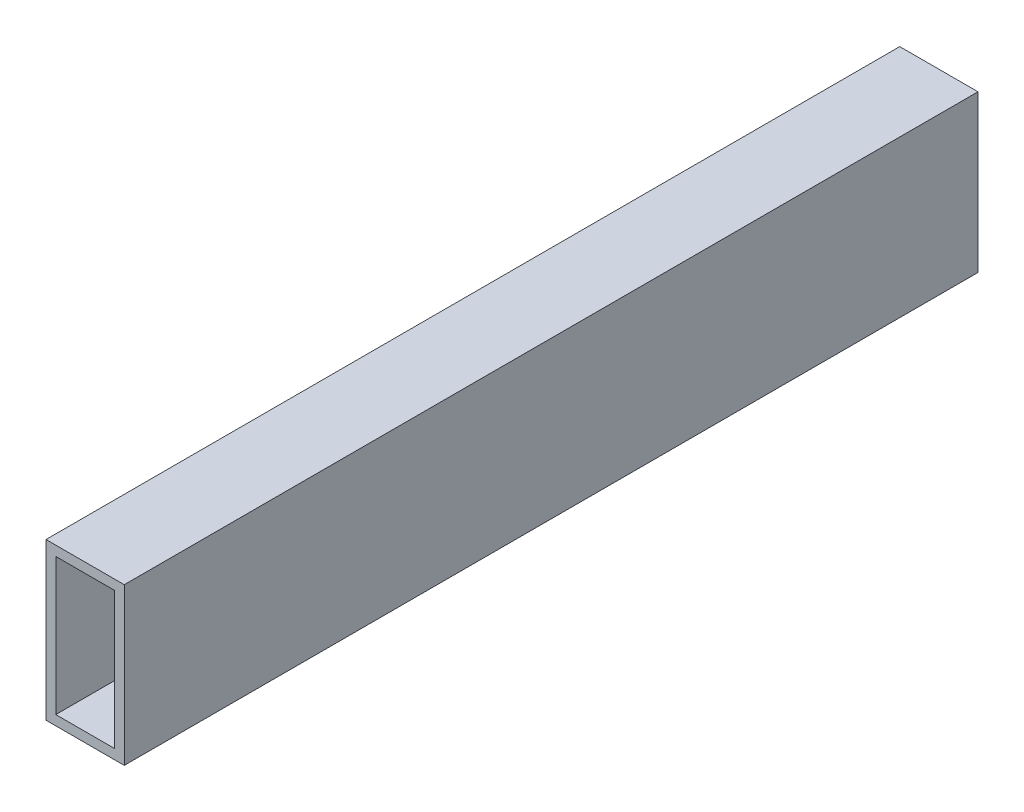
ISO-10303-21;
HEADER;
FILE_DESCRIPTION(('STEP AP214'),'2;1');
FILE_NAME('part.step','',(''),(''),'','','');
FILE_SCHEMA(('AUTOMOTIVE_DESIGN { 1 0 10303 214 1 1 1 1 }'));
ENDSEC;
DATA;
#1=APPLICATION_CONTEXT('core data for automotive mechanical design processes');
#2=APPLICATION_PROTOCOL_DEFINITION('international standard','automotive_design',2000,#1);
#3=PRODUCT_CONTEXT('',#1,'mechanical');
#4=PRODUCT('Part','Part','',(#3));
#5=PRODUCT_RELATED_PRODUCT_CATEGORY('part','',(#4));
#6=PRODUCT_DEFINITION_FORMATION('','',#4);
#7=PRODUCT_DEFINITION_CONTEXT('part definition',#1,'design');
#8=PRODUCT_DEFINITION('design','',#6,#7);
#9=PRODUCT_DEFINITION_SHAPE('','',#8);
#10=(LENGTH_UNIT() NAMED_UNIT(*) SI_UNIT(.MILLI.,.METRE.));
#11=(NAMED_UNIT(*) PLANE_ANGLE_UNIT() SI_UNIT($,.RADIAN.));
#12=(NAMED_UNIT(*) SI_UNIT($,.STERADIAN.) SOLID_ANGLE_UNIT());
#13=UNCERTAINTY_MEASURE_WITH_UNIT(LENGTH_MEASURE(1.E-05),#10,'distance_accuracy_value','');
#14=(GEOMETRIC_REPRESENTATION_CONTEXT(3) GLOBAL_UNCERTAINTY_ASSIGNED_CONTEXT((#13)) GLOBAL_UNIT_ASSIGNED_CONTEXT((#10,
#11,#12)) REPRESENTATION_CONTEXT('',''));
#15=CARTESIAN_POINT('',(0.,0.,0.));
#16=DIRECTION('',(0.,0.,1.));
#17=DIRECTION('',(1.,0.,0.));
#18=AXIS2_PLACEMENT_3D('',#15,#16,#17);
#19=CARTESIAN_POINT('',(0.,0.,277.114));
#20=DIRECTION('',(0.,0.,1.));
#21=DIRECTION('',(1.,0.,0.));
#22=AXIS2_PLACEMENT_3D('',#19,#20,#21);
#23=PLANE('',#22);
#24=DIRECTION('',(0.,1.,0.));
#25=VECTOR('',#24,1.);
#26=CARTESIAN_POINT('',(12.7,25.4,277.114));
#27=LINE('',#26,#25);
#28=CARTESIAN_POINT('',(12.7,-25.4,277.114));
#29=VERTEX_POINT('',#28);
#30=CARTESIAN_POINT('',(12.7,25.4,277.114));
#31=VERTEX_POINT('',#30);
#32=EDGE_CURVE('E153',#29,#31,#27,.T.);
#33=ORIENTED_EDGE('',*,*,#32,.T.);
#34=DIRECTION('',(-1.,0.,0.));
#35=VECTOR('',#34,1.);
#36=CARTESIAN_POINT('',(-12.7,25.4,277.114));
#37=LINE('',#36,#35);
#38=CARTESIAN_POINT('',(-12.7,25.4,277.114));
#39=VERTEX_POINT('',#38);
#40=EDGE_CURVE('E157',#31,#39,#37,.T.);
#41=ORIENTED_EDGE('',*,*,#40,.T.);
#42=DIRECTION('',(0.,-1.,0.));
#43=VECTOR('',#42,1.);
#44=CARTESIAN_POINT('',(-12.7,25.4,277.114));
#45=LINE('',#44,#43);
#46=CARTESIAN_POINT('',(-12.7,-25.4,277.114));
#47=VERTEX_POINT('',#46);
#48=EDGE_CURVE('E161',#39,#47,#45,.T.);
#49=ORIENTED_EDGE('',*,*,#48,.T.);
#50=DIRECTION('',(1.,0.,0.));
#51=VECTOR('',#50,1.);
#52=CARTESIAN_POINT('',(-12.7,-25.4,277.114));
#53=LINE('',#52,#51);
#54=EDGE_CURVE('E164',#47,#29,#53,.T.);
#55=ORIENTED_EDGE('',*,*,#54,.T.);
#56=EDGE_LOOP('',(#33,#41,#49,#55));
#57=FACE_BOUND('',#56,.T.);
#58=DIRECTION('',(1.,0.,0.));
#59=VECTOR('',#58,1.);
#60=CARTESIAN_POINT('',(-9.525,-22.225,277.114));
#61=LINE('',#60,#59);
#62=CARTESIAN_POINT('',(-9.525,-22.225,277.114));
#63=VERTEX_POINT('',#62);
#64=CARTESIAN_POINT('',(9.52500000000002,-22.225,277.114));
#65=VERTEX_POINT('',#64);
#66=EDGE_CURVE('E114',#63,#65,#61,.T.);
#67=ORIENTED_EDGE('',*,*,#66,.F.);
#68=DIRECTION('',(0.,-1.,0.));
#69=VECTOR('',#68,1.);
#70=CARTESIAN_POINT('',(-9.52500000000001,22.225,277.114));
#71=LINE('',#70,#69);
#72=CARTESIAN_POINT('',(-9.52500000000001,22.225,277.114));
#73=VERTEX_POINT('',#72);
#74=EDGE_CURVE('E105',#73,#63,#71,.T.);
#75=ORIENTED_EDGE('',*,*,#74,.F.);
#76=DIRECTION('',(-1.,0.,0.));
#77=VECTOR('',#76,1.);
#78=CARTESIAN_POINT('',(-9.52500000000001,22.225,277.114));
#79=LINE('',#78,#77);
#80=CARTESIAN_POINT('',(9.52500000000001,22.225,277.114));
#81=VERTEX_POINT('',#80);
#82=EDGE_CURVE('E131',#81,#73,#79,.T.);
#83=ORIENTED_EDGE('',*,*,#82,.F.);
#84=DIRECTION('',(0.,1.,0.));
#85=VECTOR('',#84,1.);
#86=CARTESIAN_POINT('',(9.52500000000001,22.225,277.114));
#87=LINE('',#86,#85);
#88=EDGE_CURVE('E127',#65,#81,#87,.T.);
#89=ORIENTED_EDGE('',*,*,#88,.F.);
#90=EDGE_LOOP('',(#67,#75,#83,#89));
#91=FACE_BOUND('',#90,.T.);
#92=ADVANCED_FACE('F39',(#57,#91),#23,.T.);
#93=CARTESIAN_POINT('',(0.,0.,0.));
#94=DIRECTION('',(0.,0.,1.));
#95=DIRECTION('',(1.,0.,0.));
#96=AXIS2_PLACEMENT_3D('',#93,#94,#95);
#97=PLANE('',#96);
#98=DIRECTION('',(0.,1.,0.));
#99=VECTOR('',#98,1.);
#100=CARTESIAN_POINT('',(12.7,25.4,0.));
#101=LINE('',#100,#99);
#102=CARTESIAN_POINT('',(12.7,-25.4,0.));
#103=VERTEX_POINT('',#102);
#104=CARTESIAN_POINT('',(12.7,25.4,0.));
#105=VERTEX_POINT('',#104);
#106=EDGE_CURVE('E123',#103,#105,#101,.T.);
#107=ORIENTED_EDGE('',*,*,#106,.F.);
#108=DIRECTION('',(1.,0.,0.));
#109=VECTOR('',#108,1.);
#110=CARTESIAN_POINT('',(-12.7,-25.4,0.));
#111=LINE('',#110,#109);
#112=CARTESIAN_POINT('',(-12.7,-25.4,0.));
#113=VERTEX_POINT('',#112);
#114=EDGE_CURVE('E158',#113,#103,#111,.T.);
#115=ORIENTED_EDGE('',*,*,#114,.F.);
#116=DIRECTION('',(0.,-1.,0.));
#117=VECTOR('',#116,1.);
#118=CARTESIAN_POINT('',(-12.7,25.4,0.));
#119=LINE('',#118,#117);
#120=CARTESIAN_POINT('',(-12.7,25.4,0.));
#121=VERTEX_POINT('',#120);
#122=EDGE_CURVE('E174',#121,#113,#119,.T.);
#123=ORIENTED_EDGE('',*,*,#122,.F.);
#124=DIRECTION('',(-1.,0.,0.));
#125=VECTOR('',#124,1.);
#126=CARTESIAN_POINT('',(-12.7,25.4,0.));
#127=LINE('',#126,#125);
#128=EDGE_CURVE('E171',#105,#121,#127,.T.);
#129=ORIENTED_EDGE('',*,*,#128,.F.);
#130=EDGE_LOOP('',(#107,#115,#123,#129));
#131=FACE_BOUND('',#130,.T.);
#132=DIRECTION('',(0.,-1.,0.));
#133=VECTOR('',#132,1.);
#134=CARTESIAN_POINT('',(-9.52500000000001,22.225,0.));
#135=LINE('',#134,#133);
#136=CARTESIAN_POINT('',(-9.52500000000001,22.225,0.));
#137=VERTEX_POINT('',#136);
#138=CARTESIAN_POINT('',(-9.525,-22.225,0.));
#139=VERTEX_POINT('',#138);
#140=EDGE_CURVE('E63',#137,#139,#135,.T.);
#141=ORIENTED_EDGE('',*,*,#140,.T.);
#142=DIRECTION('',(1.,0.,0.));
#143=VECTOR('',#142,1.);
#144=CARTESIAN_POINT('',(-9.525,-22.225,0.));
#145=LINE('',#144,#143);
#146=CARTESIAN_POINT('',(9.52500000000002,-22.225,0.));
#147=VERTEX_POINT('',#146);
#148=EDGE_CURVE('E121',#139,#147,#145,.T.);
#149=ORIENTED_EDGE('',*,*,#148,.T.);
#150=DIRECTION('',(0.,1.,0.));
#151=VECTOR('',#150,1.);
#152=CARTESIAN_POINT('',(9.52500000000001,22.225,0.));
#153=LINE('',#152,#151);
#154=CARTESIAN_POINT('',(9.52500000000001,22.225,0.));
#155=VERTEX_POINT('',#154);
#156=EDGE_CURVE('E140',#147,#155,#153,.T.);
#157=ORIENTED_EDGE('',*,*,#156,.T.);
#158=DIRECTION('',(-1.,0.,0.));
#159=VECTOR('',#158,1.);
#160=CARTESIAN_POINT('',(-9.52500000000001,22.225,0.));
#161=LINE('',#160,#159);
#162=EDGE_CURVE('E115',#155,#137,#161,.T.);
#163=ORIENTED_EDGE('',*,*,#162,.T.);
#164=EDGE_LOOP('',(#141,#149,#157,#163));
#165=FACE_BOUND('',#164,.T.);
#166=ADVANCED_FACE('F197',(#131,#165),#97,.F.);
#167=CARTESIAN_POINT('',(12.7,25.4,277.114));
#168=DIRECTION('',(-1.,0.,0.));
#169=DIRECTION('',(0.,0.,1.));
#170=AXIS2_PLACEMENT_3D('',#167,#168,#169);
#171=PLANE('',#170);
#172=ORIENTED_EDGE('',*,*,#106,.T.);
#173=DIRECTION('',(0.,0.,-1.));
#174=VECTOR('',#173,1.);
#175=CARTESIAN_POINT('',(12.7,25.4,277.114));
#176=LINE('',#175,#174);
#177=EDGE_CURVE('E11',#31,#105,#176,.T.);
#178=ORIENTED_EDGE('',*,*,#177,.F.);
#179=ORIENTED_EDGE('',*,*,#32,.F.);
#180=DIRECTION('',(0.,0.,-1.));
#181=VECTOR('',#180,1.);
#182=CARTESIAN_POINT('',(12.7,-25.4,277.114));
#183=LINE('',#182,#181);
#184=EDGE_CURVE('E167',#29,#103,#183,.T.);
#185=ORIENTED_EDGE('',*,*,#184,.T.);
#186=EDGE_LOOP('',(#172,#178,#179,#185));
#187=FACE_BOUND('',#186,.T.);
#188=ADVANCED_FACE('F41',(#187),#171,.F.);
#189=CARTESIAN_POINT('',(-12.7,25.4,277.114));
#190=DIRECTION('',(0.,-1.,0.));
#191=DIRECTION('',(0.,0.,-1.));
#192=AXIS2_PLACEMENT_3D('',#189,#190,#191);
#193=PLANE('',#192);
#194=ORIENTED_EDGE('',*,*,#128,.T.);
#195=DIRECTION('',(0.,0.,-1.));
#196=VECTOR('',#195,1.);
#197=CARTESIAN_POINT('',(-12.7,25.4,277.114));
#198=LINE('',#197,#196);
#199=EDGE_CURVE('E48',#39,#121,#198,.T.);
#200=ORIENTED_EDGE('',*,*,#199,.F.);
#201=ORIENTED_EDGE('',*,*,#40,.F.);
#202=ORIENTED_EDGE('',*,*,#177,.T.);
#203=EDGE_LOOP('',(#194,#200,#201,#202));
#204=FACE_BOUND('',#203,.T.);
#205=ADVANCED_FACE('F207',(#204),#193,.F.);
#206=CARTESIAN_POINT('',(-12.7,25.4,277.114));
#207=DIRECTION('',(1.,0.,0.));
#208=DIRECTION('',(0.,0.,-1.));
#209=AXIS2_PLACEMENT_3D('',#206,#207,#208);
#210=PLANE('',#209);
#211=ORIENTED_EDGE('',*,*,#122,.T.);
#212=DIRECTION('',(0.,0.,-1.));
#213=VECTOR('',#212,1.);
#214=CARTESIAN_POINT('',(-12.7,-25.4,277.114));
#215=LINE('',#214,#213);
#216=EDGE_CURVE('E182',#47,#113,#215,.T.);
#217=ORIENTED_EDGE('',*,*,#216,.F.);
#218=ORIENTED_EDGE('',*,*,#48,.F.);
#219=ORIENTED_EDGE('',*,*,#199,.T.);
#220=EDGE_LOOP('',(#211,#217,#218,#219));
#221=FACE_BOUND('',#220,.T.);
#222=ADVANCED_FACE('F191',(#221),#210,.F.);
#223=CARTESIAN_POINT('',(-12.7,-25.4,277.114));
#224=DIRECTION('',(0.,1.,0.));
#225=DIRECTION('',(0.,0.,1.));
#226=AXIS2_PLACEMENT_3D('',#223,#224,#225);
#227=PLANE('',#226);
#228=ORIENTED_EDGE('',*,*,#114,.T.);
#229=ORIENTED_EDGE('',*,*,#184,.F.);
#230=ORIENTED_EDGE('',*,*,#54,.F.);
#231=ORIENTED_EDGE('',*,*,#216,.T.);
#232=EDGE_LOOP('',(#228,#229,#230,#231));
#233=FACE_BOUND('',#232,.T.);
#234=ADVANCED_FACE('F201',(#233),#227,.F.);
#235=CARTESIAN_POINT('',(-9.52500000000001,22.225,277.114));
#236=DIRECTION('',(1.,0.,0.));
#237=DIRECTION('',(0.,1.,0.));
#238=AXIS2_PLACEMENT_3D('',#235,#236,#237);
#239=PLANE('',#238);
#240=ORIENTED_EDGE('',*,*,#140,.F.);
#241=DIRECTION('',(0.,0.,-1.));
#242=VECTOR('',#241,1.);
#243=CARTESIAN_POINT('',(-9.52500000000001,22.225,277.114));
#244=LINE('',#243,#242);
#245=EDGE_CURVE('E109',#73,#137,#244,.T.);
#246=ORIENTED_EDGE('',*,*,#245,.F.);
#247=ORIENTED_EDGE('',*,*,#74,.T.);
#248=DIRECTION('',(0.,0.,-1.));
#249=VECTOR('',#248,1.);
#250=CARTESIAN_POINT('',(-9.525,-22.225,277.114));
#251=LINE('',#250,#249);
#252=EDGE_CURVE('E108',#63,#139,#251,.T.);
#253=ORIENTED_EDGE('',*,*,#252,.T.);
#254=EDGE_LOOP('',(#240,#246,#247,#253));
#255=FACE_BOUND('',#254,.T.);
#256=ADVANCED_FACE('F107',(#255),#239,.T.);
#257=CARTESIAN_POINT('',(-9.525,-22.225,277.114));
#258=DIRECTION('',(0.,1.,0.));
#259=DIRECTION('',(-1.,0.,0.));
#260=AXIS2_PLACEMENT_3D('',#257,#258,#259);
#261=PLANE('',#260);
#262=ORIENTED_EDGE('',*,*,#148,.F.);
#263=ORIENTED_EDGE('',*,*,#252,.F.);
#264=ORIENTED_EDGE('',*,*,#66,.T.);
#265=DIRECTION('',(0.,0.,-1.));
#266=VECTOR('',#265,1.);
#267=CARTESIAN_POINT('',(9.52500000000002,-22.225,277.114));
#268=LINE('',#267,#266);
#269=EDGE_CURVE('E124',#65,#147,#268,.T.);
#270=ORIENTED_EDGE('',*,*,#269,.T.);
#271=EDGE_LOOP('',(#262,#263,#264,#270));
#272=FACE_BOUND('',#271,.T.);
#273=ADVANCED_FACE('F118',(#272),#261,.T.);
#274=CARTESIAN_POINT('',(9.52500000000001,22.225,277.114));
#275=DIRECTION('',(-1.,0.,0.));
#276=DIRECTION('',(0.,-1.,0.));
#277=AXIS2_PLACEMENT_3D('',#274,#275,#276);
#278=PLANE('',#277);
#279=ORIENTED_EDGE('',*,*,#156,.F.);
#280=ORIENTED_EDGE('',*,*,#269,.F.);
#281=ORIENTED_EDGE('',*,*,#88,.T.);
#282=DIRECTION('',(0.,0.,-1.));
#283=VECTOR('',#282,1.);
#284=CARTESIAN_POINT('',(9.52500000000001,22.225,277.114));
#285=LINE('',#284,#283);
#286=EDGE_CURVE('E55',#81,#155,#285,.T.);
#287=ORIENTED_EDGE('',*,*,#286,.T.);
#288=EDGE_LOOP('',(#279,#280,#281,#287));
#289=FACE_BOUND('',#288,.T.);
#290=ADVANCED_FACE('F230',(#289),#278,.T.);
#291=CARTESIAN_POINT('',(-9.52500000000001,22.225,277.114));
#292=DIRECTION('',(0.,-1.,0.));
#293=DIRECTION('',(1.,0.,0.));
#294=AXIS2_PLACEMENT_3D('',#291,#292,#293);
#295=PLANE('',#294);
#296=ORIENTED_EDGE('',*,*,#162,.F.);
#297=ORIENTED_EDGE('',*,*,#286,.F.);
#298=ORIENTED_EDGE('',*,*,#82,.T.);
#299=ORIENTED_EDGE('',*,*,#245,.T.);
#300=EDGE_LOOP('',(#296,#297,#298,#299));
#301=FACE_BOUND('',#300,.T.);
#302=ADVANCED_FACE('F234',(#301),#295,.T.);
#303=CLOSED_SHELL('',(#92,#166,#188,#205,#222,#234,#256,#273,#290,#302));
#304=MANIFOLD_SOLID_BREP('B2',#303);
#305=ADVANCED_BREP_SHAPE_REPRESENTATION('',(#18,#304),#14);
#306=SHAPE_DEFINITION_REPRESENTATION(#9,#305);
ENDSEC;
END-ISO-10303-21;
